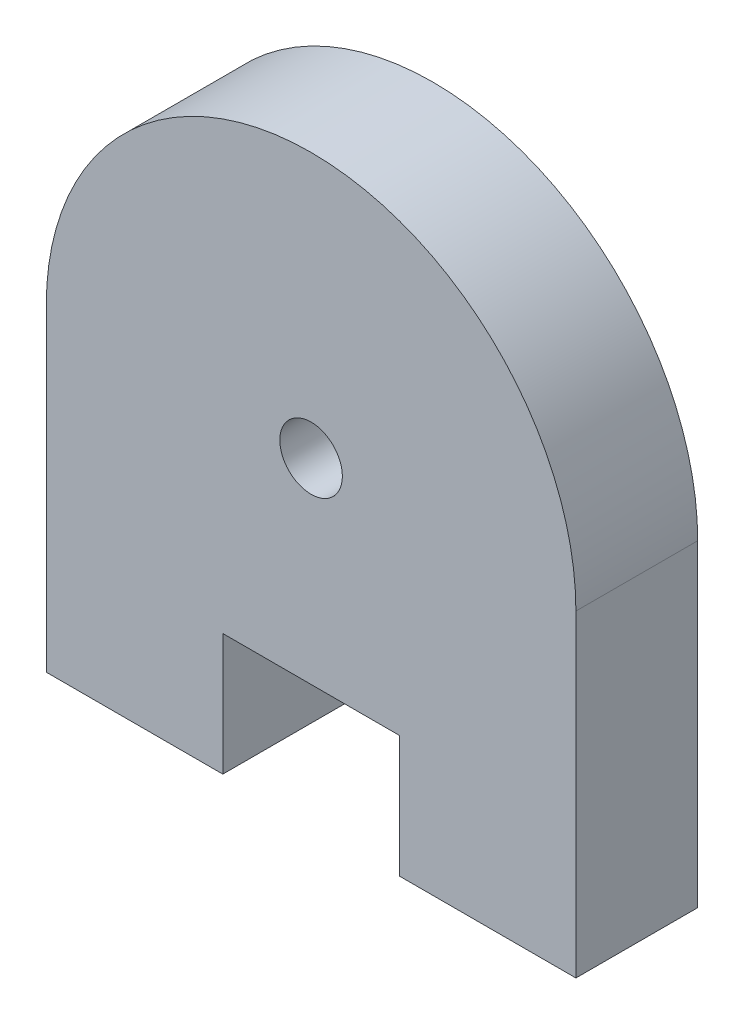
ISO-10303-21;
HEADER;
FILE_DESCRIPTION(('STEP AP214'),'2;1');
FILE_NAME('part.step','',(''),(''),'','','');
FILE_SCHEMA(('AUTOMOTIVE_DESIGN { 1 0 10303 214 1 1 1 1 }'));
ENDSEC;
DATA;
#1=APPLICATION_CONTEXT('core data for automotive mechanical design processes');
#2=APPLICATION_PROTOCOL_DEFINITION('international standard','automotive_design',2000,#1);
#3=PRODUCT_CONTEXT('',#1,'mechanical');
#4=PRODUCT('Part','Part','',(#3));
#5=PRODUCT_RELATED_PRODUCT_CATEGORY('part','',(#4));
#6=PRODUCT_DEFINITION_FORMATION('','',#4);
#7=PRODUCT_DEFINITION_CONTEXT('part definition',#1,'design');
#8=PRODUCT_DEFINITION('design','',#6,#7);
#9=PRODUCT_DEFINITION_SHAPE('','',#8);
#10=(LENGTH_UNIT() NAMED_UNIT(*) SI_UNIT(.MILLI.,.METRE.));
#11=(NAMED_UNIT(*) PLANE_ANGLE_UNIT() SI_UNIT($,.RADIAN.));
#12=(NAMED_UNIT(*) SI_UNIT($,.STERADIAN.) SOLID_ANGLE_UNIT());
#13=UNCERTAINTY_MEASURE_WITH_UNIT(LENGTH_MEASURE(1.E-05),#10,'distance_accuracy_value','');
#14=(GEOMETRIC_REPRESENTATION_CONTEXT(3) GLOBAL_UNCERTAINTY_ASSIGNED_CONTEXT((#13)) GLOBAL_UNIT_ASSIGNED_CONTEXT((#10,
#11,#12)) REPRESENTATION_CONTEXT('',''));
#15=CARTESIAN_POINT('',(0.,0.,0.));
#16=DIRECTION('',(0.,0.,1.));
#17=DIRECTION('',(1.,0.,0.));
#18=AXIS2_PLACEMENT_3D('',#15,#16,#17);
#19=CARTESIAN_POINT('',(10.2204761904762,-9.525,5.842));
#20=DIRECTION('',(0.,1.,0.));
#21=DIRECTION('',(-1.,0.,0.));
#22=AXIS2_PLACEMENT_3D('',#19,#20,#21);
#23=PLANE('',#22);
#24=DIRECTION('',(1.,0.,0.));
#25=VECTOR('',#24,1.);
#26=CARTESIAN_POINT('',(10.2204761904762,-9.525,0.));
#27=LINE('',#26,#25);
#28=CARTESIAN_POINT('',(-15.1795238095238,-9.525,0.));
#29=VERTEX_POINT('',#28);
#30=CARTESIAN_POINT('',(-6.71285714285715,-9.525,0.));
#31=VERTEX_POINT('',#30);
#32=EDGE_CURVE('E133',#29,#31,#27,.T.);
#33=ORIENTED_EDGE('',*,*,#32,.T.);
#34=DIRECTION('',(0.,0.,1.));
#35=VECTOR('',#34,1.);
#36=CARTESIAN_POINT('',(-6.71285714285715,-9.525,0.));
#37=LINE('',#36,#35);
#38=CARTESIAN_POINT('',(-6.71285714285715,-9.525,5.842));
#39=VERTEX_POINT('',#38);
#40=EDGE_CURVE('E114',#31,#39,#37,.T.);
#41=ORIENTED_EDGE('',*,*,#40,.T.);
#42=DIRECTION('',(1.,0.,0.));
#43=VECTOR('',#42,1.);
#44=CARTESIAN_POINT('',(10.2204761904762,-9.525,5.842));
#45=LINE('',#44,#43);
#46=CARTESIAN_POINT('',(-15.1795238095238,-9.525,5.842));
#47=VERTEX_POINT('',#46);
#48=EDGE_CURVE('E158',#47,#39,#45,.T.);
#49=ORIENTED_EDGE('',*,*,#48,.F.);
#50=DIRECTION('',(0.,0.,-1.));
#51=VECTOR('',#50,1.);
#52=CARTESIAN_POINT('',(-15.1795238095238,-9.525,5.842));
#53=LINE('',#52,#51);
#54=EDGE_CURVE('E48',#47,#29,#53,.T.);
#55=ORIENTED_EDGE('',*,*,#54,.T.);
#56=EDGE_LOOP('',(#33,#41,#49,#55));
#57=FACE_BOUND('',#56,.T.);
#58=ADVANCED_FACE('F39',(#57),#23,.F.);
#59=CARTESIAN_POINT('',(-2.47952380952382,5.715,5.842));
#60=DIRECTION('',(0.,0.,1.));
#61=DIRECTION('',(1.,0.,0.));
#62=AXIS2_PLACEMENT_3D('',#59,#60,#61);
#63=PLANE('',#62);
#64=DIRECTION('',(0.,-1.,0.));
#65=VECTOR('',#64,1.);
#66=CARTESIAN_POINT('',(-6.71285714285715,-9.525,5.842));
#67=LINE('',#66,#65);
#68=CARTESIAN_POINT('',(-6.71285714285715,-3.683,5.842));
#69=VERTEX_POINT('',#68);
#70=EDGE_CURVE('E120',#69,#39,#67,.T.);
#71=ORIENTED_EDGE('',*,*,#70,.F.);
#72=DIRECTION('',(-1.,0.,0.));
#73=VECTOR('',#72,1.);
#74=CARTESIAN_POINT('',(-6.71285714285715,-3.683,5.842));
#75=LINE('',#74,#73);
#76=CARTESIAN_POINT('',(1.75380952380952,-3.683,5.842));
#77=VERTEX_POINT('',#76);
#78=EDGE_CURVE('E136',#77,#69,#75,.T.);
#79=ORIENTED_EDGE('',*,*,#78,.F.);
#80=DIRECTION('',(0.,1.,0.));
#81=VECTOR('',#80,1.);
#82=CARTESIAN_POINT('',(1.75380952380952,-9.525,5.842));
#83=LINE('',#82,#81);
#84=CARTESIAN_POINT('',(1.75380952380952,-9.525,5.842));
#85=VERTEX_POINT('',#84);
#86=EDGE_CURVE('E197',#85,#77,#83,.T.);
#87=ORIENTED_EDGE('',*,*,#86,.F.);
#88=CARTESIAN_POINT('',(10.2204761904762,-9.525,5.842));
#89=VERTEX_POINT('',#88);
#90=EDGE_CURVE('E161',#85,#89,#45,.T.);
#91=ORIENTED_EDGE('',*,*,#90,.T.);
#92=DIRECTION('',(0.,1.,0.));
#93=VECTOR('',#92,1.);
#94=CARTESIAN_POINT('',(10.2204761904762,-9.525,5.842));
#95=LINE('',#94,#93);
#96=CARTESIAN_POINT('',(10.2204761904762,5.715,5.842));
#97=VERTEX_POINT('',#96);
#98=EDGE_CURVE('E64',#89,#97,#95,.T.);
#99=ORIENTED_EDGE('',*,*,#98,.T.);
#100=CARTESIAN_POINT('',(-2.47952380952382,5.715,5.842));
#101=DIRECTION('',(0.,0.,1.));
#102=DIRECTION('',(1.,0.,0.));
#103=AXIS2_PLACEMENT_3D('',#100,#101,#102);
#104=CIRCLE('',#103,12.7);
#105=CARTESIAN_POINT('',(-15.1795238095238,5.715,5.842));
#106=VERTEX_POINT('',#105);
#107=EDGE_CURVE('E144',#97,#106,#104,.T.);
#108=ORIENTED_EDGE('',*,*,#107,.T.);
#109=DIRECTION('',(0.,-1.,0.));
#110=VECTOR('',#109,1.);
#111=CARTESIAN_POINT('',(-15.1795238095238,-9.525,5.842));
#112=LINE('',#111,#110);
#113=EDGE_CURVE('E92',#106,#47,#112,.T.);
#114=ORIENTED_EDGE('',*,*,#113,.T.);
#115=ORIENTED_EDGE('',*,*,#48,.T.);
#116=EDGE_LOOP('',(#71,#79,#87,#91,#99,#108,#114,#115));
#117=FACE_BOUND('',#116,.T.);
#118=CARTESIAN_POINT('',(-2.47952380952382,5.715,5.842));
#119=DIRECTION('',(0.,0.,1.));
#120=DIRECTION('',(1.,0.,0.));
#121=AXIS2_PLACEMENT_3D('',#118,#119,#120);
#122=CIRCLE('',#121,1.5);
#123=CARTESIAN_POINT('',(-0.979523809523816,5.715,5.842));
#124=VERTEX_POINT('',#123);
#125=EDGE_CURVE('E175',#124,#124,#122,.T.);
#126=ORIENTED_EDGE('',*,*,#125,.F.);
#127=EDGE_LOOP('',(#126));
#128=FACE_BOUND('',#127,.T.);
#129=ADVANCED_FACE('F213',(#117,#128),#63,.T.);
#130=CARTESIAN_POINT('',(-2.47952380952382,5.715,0.));
#131=DIRECTION('',(0.,0.,1.));
#132=DIRECTION('',(1.,0.,0.));
#133=AXIS2_PLACEMENT_3D('',#130,#131,#132);
#134=PLANE('',#133);
#135=DIRECTION('',(-1.,0.,0.));
#136=VECTOR('',#135,1.);
#137=CARTESIAN_POINT('',(-6.71285714285715,-3.683,0.));
#138=LINE('',#137,#136);
#139=CARTESIAN_POINT('',(1.75380952380952,-3.683,0.));
#140=VERTEX_POINT('',#139);
#141=CARTESIAN_POINT('',(-6.71285714285715,-3.683,0.));
#142=VERTEX_POINT('',#141);
#143=EDGE_CURVE('E127',#140,#142,#138,.T.);
#144=ORIENTED_EDGE('',*,*,#143,.T.);
#145=DIRECTION('',(0.,-1.,0.));
#146=VECTOR('',#145,1.);
#147=CARTESIAN_POINT('',(-6.71285714285715,-9.525,0.));
#148=LINE('',#147,#146);
#149=EDGE_CURVE('E117',#142,#31,#148,.T.);
#150=ORIENTED_EDGE('',*,*,#149,.T.);
#151=ORIENTED_EDGE('',*,*,#32,.F.);
#152=DIRECTION('',(0.,-1.,0.));
#153=VECTOR('',#152,1.);
#154=CARTESIAN_POINT('',(-15.1795238095238,-9.525,0.));
#155=LINE('',#154,#153);
#156=CARTESIAN_POINT('',(-15.1795238095238,5.715,0.));
#157=VERTEX_POINT('',#156);
#158=EDGE_CURVE('E146',#157,#29,#155,.T.);
#159=ORIENTED_EDGE('',*,*,#158,.F.);
#160=CARTESIAN_POINT('',(-2.47952380952382,5.715,0.));
#161=DIRECTION('',(0.,0.,1.));
#162=DIRECTION('',(1.,0.,0.));
#163=AXIS2_PLACEMENT_3D('',#160,#161,#162);
#164=CIRCLE('',#163,12.7);
#165=CARTESIAN_POINT('',(10.2204761904762,5.715,0.));
#166=VERTEX_POINT('',#165);
#167=EDGE_CURVE('E172',#166,#157,#164,.T.);
#168=ORIENTED_EDGE('',*,*,#167,.F.);
#169=DIRECTION('',(0.,1.,0.));
#170=VECTOR('',#169,1.);
#171=CARTESIAN_POINT('',(10.2204761904762,-9.525,0.));
#172=LINE('',#171,#170);
#173=CARTESIAN_POINT('',(10.2204761904762,-9.525,0.));
#174=VERTEX_POINT('',#173);
#175=EDGE_CURVE('E85',#174,#166,#172,.T.);
#176=ORIENTED_EDGE('',*,*,#175,.F.);
#177=CARTESIAN_POINT('',(1.75380952380952,-9.525,0.));
#178=VERTEX_POINT('',#177);
#179=EDGE_CURVE('E140',#178,#174,#27,.T.);
#180=ORIENTED_EDGE('',*,*,#179,.F.);
#181=DIRECTION('',(0.,1.,0.));
#182=VECTOR('',#181,1.);
#183=CARTESIAN_POINT('',(1.75380952380952,-9.525,0.));
#184=LINE('',#183,#182);
#185=EDGE_CURVE('E55',#178,#140,#184,.T.);
#186=ORIENTED_EDGE('',*,*,#185,.T.);
#187=EDGE_LOOP('',(#144,#150,#151,#159,#168,#176,#180,#186));
#188=FACE_BOUND('',#187,.T.);
#189=CARTESIAN_POINT('',(-2.47952380952382,5.715,0.));
#190=DIRECTION('',(0.,0.,1.));
#191=DIRECTION('',(1.,0.,0.));
#192=AXIS2_PLACEMENT_3D('',#189,#190,#191);
#193=CIRCLE('',#192,1.5);
#194=CARTESIAN_POINT('',(-0.979523809523816,5.715,0.));
#195=VERTEX_POINT('',#194);
#196=EDGE_CURVE('E170',#195,#195,#193,.T.);
#197=ORIENTED_EDGE('',*,*,#196,.T.);
#198=EDGE_LOOP('',(#197));
#199=FACE_BOUND('',#198,.T.);
#200=ADVANCED_FACE('F131',(#188,#199),#134,.F.);
#201=CARTESIAN_POINT('',(-2.47952380952382,5.715,5.842));
#202=DIRECTION('',(0.,0.,-1.));
#203=DIRECTION('',(-1.,0.,0.));
#204=AXIS2_PLACEMENT_3D('',#201,#202,#203);
#205=CYLINDRICAL_SURFACE('',#204,12.7);
#206=ORIENTED_EDGE('',*,*,#167,.T.);
#207=DIRECTION('',(0.,0.,-1.));
#208=VECTOR('',#207,1.);
#209=CARTESIAN_POINT('',(-15.1795238095238,5.715,5.842));
#210=LINE('',#209,#208);
#211=EDGE_CURVE('E11',#106,#157,#210,.T.);
#212=ORIENTED_EDGE('',*,*,#211,.F.);
#213=ORIENTED_EDGE('',*,*,#107,.F.);
#214=DIRECTION('',(0.,0.,-1.));
#215=VECTOR('',#214,1.);
#216=CARTESIAN_POINT('',(10.2204761904762,5.715,5.842));
#217=LINE('',#216,#215);
#218=EDGE_CURVE('E150',#97,#166,#217,.T.);
#219=ORIENTED_EDGE('',*,*,#218,.T.);
#220=EDGE_LOOP('',(#206,#212,#213,#219));
#221=FACE_BOUND('',#220,.T.);
#222=ADVANCED_FACE('F41',(#221),#205,.T.);
#223=CARTESIAN_POINT('',(-15.1795238095238,-9.525,5.842));
#224=DIRECTION('',(1.,0.,0.));
#225=DIRECTION('',(0.,0.,-1.));
#226=AXIS2_PLACEMENT_3D('',#223,#224,#225);
#227=PLANE('',#226);
#228=ORIENTED_EDGE('',*,*,#158,.T.);
#229=ORIENTED_EDGE('',*,*,#54,.F.);
#230=ORIENTED_EDGE('',*,*,#113,.F.);
#231=ORIENTED_EDGE('',*,*,#211,.T.);
#232=EDGE_LOOP('',(#228,#229,#230,#231));
#233=FACE_BOUND('',#232,.T.);
#234=ADVANCED_FACE('F212',(#233),#227,.F.);
#235=ORIENTED_EDGE('',*,*,#90,.F.);
#236=DIRECTION('',(0.,0.,1.));
#237=VECTOR('',#236,1.);
#238=CARTESIAN_POINT('',(1.75380952380952,-9.525,0.));
#239=LINE('',#238,#237);
#240=EDGE_CURVE('E126',#178,#85,#239,.T.);
#241=ORIENTED_EDGE('',*,*,#240,.F.);
#242=ORIENTED_EDGE('',*,*,#179,.T.);
#243=DIRECTION('',(0.,0.,-1.));
#244=VECTOR('',#243,1.);
#245=CARTESIAN_POINT('',(10.2204761904762,-9.525,5.842));
#246=LINE('',#245,#244);
#247=EDGE_CURVE('E153',#89,#174,#246,.T.);
#248=ORIENTED_EDGE('',*,*,#247,.F.);
#249=EDGE_LOOP('',(#235,#241,#242,#248));
#250=FACE_BOUND('',#249,.T.);
#251=ADVANCED_FACE('F210',(#250),#23,.F.);
#252=CARTESIAN_POINT('',(10.2204761904762,-9.525,5.842));
#253=DIRECTION('',(-1.,0.,0.));
#254=DIRECTION('',(0.,0.,1.));
#255=AXIS2_PLACEMENT_3D('',#252,#253,#254);
#256=PLANE('',#255);
#257=ORIENTED_EDGE('',*,*,#175,.T.);
#258=ORIENTED_EDGE('',*,*,#218,.F.);
#259=ORIENTED_EDGE('',*,*,#98,.F.);
#260=ORIENTED_EDGE('',*,*,#247,.T.);
#261=EDGE_LOOP('',(#257,#258,#259,#260));
#262=FACE_BOUND('',#261,.T.);
#263=ADVANCED_FACE('F211',(#262),#256,.F.);
#264=CARTESIAN_POINT('',(-2.47952380952382,5.715,5.842));
#265=DIRECTION('',(0.,0.,-1.));
#266=DIRECTION('',(-1.,0.,0.));
#267=AXIS2_PLACEMENT_3D('',#264,#265,#266);
#268=CYLINDRICAL_SURFACE('',#267,1.5);
#269=ORIENTED_EDGE('',*,*,#125,.T.);
#270=EDGE_LOOP('',(#269));
#271=FACE_BOUND('',#270,.T.);
#272=ORIENTED_EDGE('',*,*,#196,.F.);
#273=EDGE_LOOP('',(#272));
#274=FACE_BOUND('',#273,.T.);
#275=ADVANCED_FACE('F239',(#271,#274),#268,.F.);
#276=CARTESIAN_POINT('',(-6.71285714285715,-9.525,0.));
#277=DIRECTION('',(-1.,0.,0.));
#278=DIRECTION('',(0.,0.,1.));
#279=AXIS2_PLACEMENT_3D('',#276,#277,#278);
#280=PLANE('',#279);
#281=ORIENTED_EDGE('',*,*,#70,.T.);
#282=ORIENTED_EDGE('',*,*,#40,.F.);
#283=ORIENTED_EDGE('',*,*,#149,.F.);
#284=DIRECTION('',(0.,0.,1.));
#285=VECTOR('',#284,1.);
#286=CARTESIAN_POINT('',(-6.71285714285715,-3.683,0.));
#287=LINE('',#286,#285);
#288=EDGE_CURVE('E185',#142,#69,#287,.T.);
#289=ORIENTED_EDGE('',*,*,#288,.T.);
#290=EDGE_LOOP('',(#281,#282,#283,#289));
#291=FACE_BOUND('',#290,.T.);
#292=ADVANCED_FACE('F116',(#291),#280,.F.);
#293=CARTESIAN_POINT('',(-6.71285714285715,-3.683,0.));
#294=DIRECTION('',(0.,1.,0.));
#295=DIRECTION('',(0.,0.,1.));
#296=AXIS2_PLACEMENT_3D('',#293,#294,#295);
#297=PLANE('',#296);
#298=ORIENTED_EDGE('',*,*,#78,.T.);
#299=ORIENTED_EDGE('',*,*,#288,.F.);
#300=ORIENTED_EDGE('',*,*,#143,.F.);
#301=DIRECTION('',(0.,0.,1.));
#302=VECTOR('',#301,1.);
#303=CARTESIAN_POINT('',(1.75380952380952,-3.683,0.));
#304=LINE('',#303,#302);
#305=EDGE_CURVE('E189',#140,#77,#304,.T.);
#306=ORIENTED_EDGE('',*,*,#305,.T.);
#307=EDGE_LOOP('',(#298,#299,#300,#306));
#308=FACE_BOUND('',#307,.T.);
#309=ADVANCED_FACE('F218',(#308),#297,.F.);
#310=CARTESIAN_POINT('',(1.75380952380952,-9.525,0.));
#311=DIRECTION('',(1.,0.,0.));
#312=DIRECTION('',(0.,0.,-1.));
#313=AXIS2_PLACEMENT_3D('',#310,#311,#312);
#314=PLANE('',#313);
#315=ORIENTED_EDGE('',*,*,#86,.T.);
#316=ORIENTED_EDGE('',*,*,#305,.F.);
#317=ORIENTED_EDGE('',*,*,#185,.F.);
#318=ORIENTED_EDGE('',*,*,#240,.T.);
#319=EDGE_LOOP('',(#315,#316,#317,#318));
#320=FACE_BOUND('',#319,.T.);
#321=ADVANCED_FACE('F219',(#320),#314,.F.);
#322=CLOSED_SHELL('',(#58,#129,#200,#222,#234,#251,#263,#275,#292,#309,#321));
#323=MANIFOLD_SOLID_BREP('B2',#322);
#324=ADVANCED_BREP_SHAPE_REPRESENTATION('',(#18,#323),#14);
#325=SHAPE_DEFINITION_REPRESENTATION(#9,#324);
ENDSEC;
END-ISO-10303-21;
